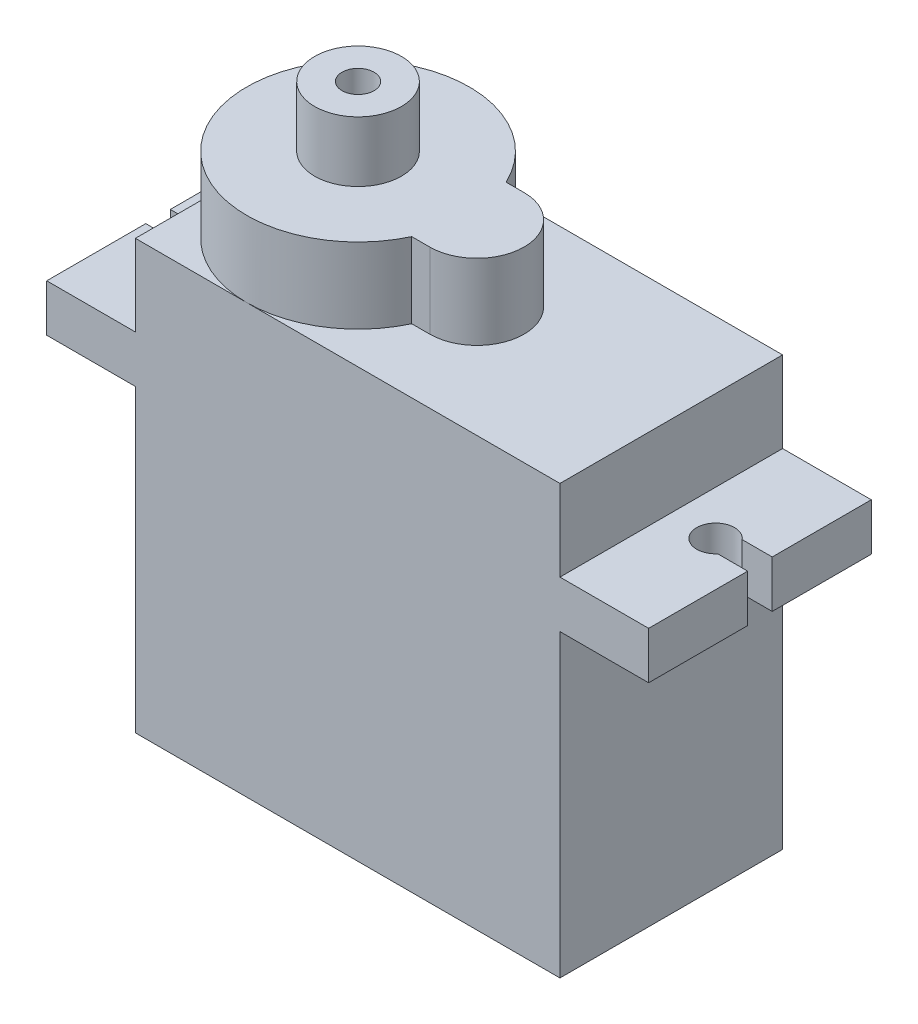
ISO-10303-21;
HEADER;
FILE_DESCRIPTION(('STEP AP214'),'2;1');
FILE_NAME('part.step','',(''),(''),'','','');
FILE_SCHEMA(('AUTOMOTIVE_DESIGN { 1 0 10303 214 1 1 1 1 }'));
ENDSEC;
DATA;
#1=APPLICATION_CONTEXT('core data for automotive mechanical design processes');
#2=APPLICATION_PROTOCOL_DEFINITION('international standard','automotive_design',2000,#1);
#3=PRODUCT_CONTEXT('',#1,'mechanical');
#4=PRODUCT('Part','Part','',(#3));
#5=PRODUCT_RELATED_PRODUCT_CATEGORY('part','',(#4));
#6=PRODUCT_DEFINITION_FORMATION('','',#4);
#7=PRODUCT_DEFINITION_CONTEXT('part definition',#1,'design');
#8=PRODUCT_DEFINITION('design','',#6,#7);
#9=PRODUCT_DEFINITION_SHAPE('','',#8);
#10=(LENGTH_UNIT() NAMED_UNIT(*) SI_UNIT(.MILLI.,.METRE.));
#11=(NAMED_UNIT(*) PLANE_ANGLE_UNIT() SI_UNIT($,.RADIAN.));
#12=(NAMED_UNIT(*) SI_UNIT($,.STERADIAN.) SOLID_ANGLE_UNIT());
#13=UNCERTAINTY_MEASURE_WITH_UNIT(LENGTH_MEASURE(1.E-05),#10,'distance_accuracy_value','');
#14=(GEOMETRIC_REPRESENTATION_CONTEXT(3) GLOBAL_UNCERTAINTY_ASSIGNED_CONTEXT((#13)) GLOBAL_UNIT_ASSIGNED_CONTEXT((#10,
#11,#12)) REPRESENTATION_CONTEXT('',''));
#15=CARTESIAN_POINT('',(0.,0.,0.));
#16=DIRECTION('',(0.,0.,1.));
#17=DIRECTION('',(1.,0.,0.));
#18=AXIS2_PLACEMENT_3D('',#15,#16,#17);
#19=CARTESIAN_POINT('',(-4.78141882639046,16.9586677185321,37.7999999999969));
#20=DIRECTION('',(0.,-1.,0.));
#21=DIRECTION('',(-0.804603244322576,0.,0.59381278129188));
#22=AXIS2_PLACEMENT_3D('',#19,#20,#21);
#23=CYLINDRICAL_SURFACE('',#22,2.3);
#24=CARTESIAN_POINT('',(-4.78141882639046,16.9586677185321,37.7999999999969));
#25=DIRECTION('',(0.,1.,0.));
#26=DIRECTION('',(0.804603244322576,0.,-0.59381278129188));
#27=AXIS2_PLACEMENT_3D('',#24,#25,#26);
#28=CIRCLE('',#27,2.3);
#29=CARTESIAN_POINT('',(-2.93083136444853,16.9586677185321,36.4342306030256));
#30=VERTEX_POINT('',#29);
#31=EDGE_CURVE('P0_E10',#30,#30,#28,.T.);
#32=ORIENTED_EDGE('',*,*,#31,.F.);
#33=EDGE_LOOP('',(#32));
#34=FACE_BOUND('',#33,.T.);
#35=CARTESIAN_POINT('',(-4.78141882639046,9.75866771853212,37.7999999999969));
#36=DIRECTION('',(0.,1.,0.));
#37=DIRECTION('',(0.804603244322576,0.,-0.59381278129188));
#38=AXIS2_PLACEMENT_3D('',#35,#36,#37);
#39=CIRCLE('',#38,2.3);
#40=CARTESIAN_POINT('',(-2.93083136444853,9.75866771853212,36.4342306030256));
#41=VERTEX_POINT('',#40);
#42=EDGE_CURVE('P0_E20',#41,#41,#39,.T.);
#43=ORIENTED_EDGE('',*,*,#42,.T.);
#44=EDGE_LOOP('',(#43));
#45=FACE_BOUND('',#44,.T.);
#46=ADVANCED_FACE('P0_F17',(#34,#45),#23,.T.);
#47=CARTESIAN_POINT('',(-4.78141882639046,16.9586677185321,37.7999999999969));
#48=DIRECTION('',(0.,1.,0.));
#49=DIRECTION('',(0.804603244322576,0.,-0.59381278129188));
#50=AXIS2_PLACEMENT_3D('',#47,#48,#49);
#51=PLANE('',#50);
#52=CARTESIAN_POINT('',(-4.78141882639046,16.9586677185321,37.7999999999969));
#53=DIRECTION('',(0.,1.,0.));
#54=DIRECTION('',(0.804603244322576,0.,-0.59381278129188));
#55=AXIS2_PLACEMENT_3D('',#52,#53,#54);
#56=CIRCLE('',#55,0.85);
#57=CARTESIAN_POINT('',(-4.09750606871627,16.9586677185321,37.2952591358988));
#58=VERTEX_POINT('',#57);
#59=EDGE_CURVE('P0_E29',#58,#58,#56,.T.);
#60=ORIENTED_EDGE('',*,*,#59,.F.);
#61=EDGE_LOOP('',(#60));
#62=FACE_BOUND('',#61,.T.);
#63=ORIENTED_EDGE('',*,*,#31,.T.);
#64=EDGE_LOOP('',(#63));
#65=FACE_BOUND('',#64,.T.);
#66=ADVANCED_FACE('P0_F44',(#62,#65),#51,.T.);
#67=CARTESIAN_POINT('',(-4.78141882639046,9.75866771853212,37.7999999999969));
#68=DIRECTION('',(0.,1.,0.));
#69=DIRECTION('',(0.804603244322576,0.,-0.59381278129188));
#70=AXIS2_PLACEMENT_3D('',#67,#68,#69);
#71=PLANE('',#70);
#72=ORIENTED_EDGE('',*,*,#42,.F.);
#73=EDGE_LOOP('',(#72));
#74=FACE_BOUND('',#73,.T.);
#75=ADVANCED_FACE('P0_F40',(#74),#71,.F.);
#76=CARTESIAN_POINT('',(-4.78141882639046,13.3586677185321,37.7999999999969));
#77=DIRECTION('',(0.,1.,0.));
#78=DIRECTION('',(0.804603244322576,0.,-0.59381278129188));
#79=AXIS2_PLACEMENT_3D('',#76,#77,#78);
#80=CYLINDRICAL_SURFACE('',#79,0.85);
#81=CARTESIAN_POINT('',(-4.78141882639046,13.3586677185321,37.7999999999969));
#82=DIRECTION('',(0.,1.,0.));
#83=DIRECTION('',(0.804603244322576,0.,-0.59381278129188));
#84=AXIS2_PLACEMENT_3D('',#81,#82,#83);
#85=CIRCLE('',#84,0.85);
#86=CARTESIAN_POINT('',(-4.09750606871627,13.3586677185321,37.2952591358988));
#87=VERTEX_POINT('',#86);
#88=EDGE_CURVE('P0_E27',#87,#87,#85,.T.);
#89=ORIENTED_EDGE('',*,*,#88,.F.);
#90=EDGE_LOOP('',(#89));
#91=FACE_BOUND('',#90,.T.);
#92=ORIENTED_EDGE('',*,*,#59,.T.);
#93=EDGE_LOOP('',(#92));
#94=FACE_BOUND('',#93,.T.);
#95=ADVANCED_FACE('P0_F37',(#91,#94),#80,.F.);
#96=CARTESIAN_POINT('',(-4.78141882639046,13.3586677185321,37.7999999999969));
#97=DIRECTION('',(0.,1.,0.));
#98=DIRECTION('',(0.804603244322576,0.,-0.59381278129188));
#99=AXIS2_PLACEMENT_3D('',#96,#97,#98);
#100=PLANE('',#99);
#101=ORIENTED_EDGE('',*,*,#88,.T.);
#102=EDGE_LOOP('',(#101));
#103=FACE_BOUND('',#102,.T.);
#104=ADVANCED_FACE('P0_F35',(#103),#100,.T.);
#105=CLOSED_SHELL('',(#46,#66,#75,#95,#104));
#106=MANIFOLD_SOLID_BREP('P0_B1',#105);
#107=CARTESIAN_POINT('',(11.8185811736095,2.95866771853212,43.6999999999969));
#108=DIRECTION('',(0.,1.,0.));
#109=DIRECTION('',(-1.,0.,0.));
#110=AXIS2_PLACEMENT_3D('',#107,#108,#109);
#111=PLANE('',#110);
#112=DIRECTION('',(1.,0.,0.));
#113=VECTOR('',#112,1.);
#114=CARTESIAN_POINT('',(11.8185811736095,2.95866771853212,37.1499999999969));
#115=LINE('',#114,#113);
#116=CARTESIAN_POINT('',(14.9285153812881,2.95866771853213,37.1499999999969));
#117=VERTEX_POINT('',#116);
#118=CARTESIAN_POINT('',(16.5185811736095,2.95866771853213,37.1499999999969));
#119=VERTEX_POINT('',#118);
#120=EDGE_CURVE('P1_E430',#117,#119,#115,.T.);
#121=ORIENTED_EDGE('',*,*,#120,.F.);
#122=CARTESIAN_POINT('',(14.1685811736095,2.95866771853212,37.7999999999969));
#123=DIRECTION('',(0.,1.,0.));
#124=DIRECTION('',(-1.,0.,0.));
#125=AXIS2_PLACEMENT_3D('',#122,#123,#124);
#126=CIRCLE('',#125,1.);
#127=CARTESIAN_POINT('',(14.9285153812881,2.95866771853213,38.4499999999969));
#128=VERTEX_POINT('',#127);
#129=EDGE_CURVE('P1_E429',#128,#117,#126,.F.);
#130=ORIENTED_EDGE('',*,*,#129,.F.);
#131=DIRECTION('',(-1.,0.,0.));
#132=VECTOR('',#131,1.);
#133=CARTESIAN_POINT('',(11.8185811736095,2.95866771853212,38.4499999999969));
#134=LINE('',#133,#132);
#135=CARTESIAN_POINT('',(16.5185811736095,2.95866771853213,38.4499999999969));
#136=VERTEX_POINT('',#135);
#137=EDGE_CURVE('P1_E428',#136,#128,#134,.T.);
#138=ORIENTED_EDGE('',*,*,#137,.F.);
#139=DIRECTION('',(0.,0.,-1.));
#140=VECTOR('',#139,1.);
#141=CARTESIAN_POINT('',(16.5185811736095,2.95866771853213,43.6999999999969));
#142=LINE('',#141,#140);
#143=CARTESIAN_POINT('',(16.5185811736095,2.95866771853213,43.6999999999969));
#144=VERTEX_POINT('',#143);
#145=EDGE_CURVE('P1_E207',#144,#136,#142,.T.);
#146=ORIENTED_EDGE('',*,*,#145,.F.);
#147=DIRECTION('',(1.,0.,0.));
#148=VECTOR('',#147,1.);
#149=CARTESIAN_POINT('',(11.8185811736095,2.95866771853212,43.6999999999969));
#150=LINE('',#149,#148);
#151=CARTESIAN_POINT('',(11.8185811736095,2.95866771853212,43.6999999999969));
#152=VERTEX_POINT('',#151);
#153=EDGE_CURVE('P1_E309',#152,#144,#150,.T.);
#154=ORIENTED_EDGE('',*,*,#153,.F.);
#155=DIRECTION('',(0.,0.,-1.));
#156=VECTOR('',#155,1.);
#157=CARTESIAN_POINT('',(11.8185811736095,2.95866771853212,43.6999999999969));
#158=LINE('',#157,#156);
#159=CARTESIAN_POINT('',(11.8185811736095,2.95866771853212,31.8999999999969));
#160=VERTEX_POINT('',#159);
#161=EDGE_CURVE('P1_E222',#152,#160,#158,.T.);
#162=ORIENTED_EDGE('',*,*,#161,.T.);
#163=DIRECTION('',(1.,0.,0.));
#164=VECTOR('',#163,1.);
#165=CARTESIAN_POINT('',(11.8185811736095,2.95866771853212,31.8999999999969));
#166=LINE('',#165,#164);
#167=CARTESIAN_POINT('',(16.5185811736095,2.95866771853213,31.8999999999969));
#168=VERTEX_POINT('',#167);
#169=EDGE_CURVE('P1_E335',#160,#168,#166,.T.);
#170=ORIENTED_EDGE('',*,*,#169,.T.);
#171=EDGE_CURVE('P1_E214',#119,#168,#142,.T.);
#172=ORIENTED_EDGE('',*,*,#171,.F.);
#173=EDGE_LOOP('',(#121,#130,#138,#146,#154,#162,#170,#172));
#174=FACE_BOUND('',#173,.T.);
#175=ADVANCED_FACE('P1_F19',(#174),#111,.F.);
#176=CARTESIAN_POINT('',(16.5185811736095,2.95866771853213,43.6999999999969));
#177=DIRECTION('',(-1.,0.,0.));
#178=DIRECTION('',(0.,-1.,0.));
#179=AXIS2_PLACEMENT_3D('',#176,#177,#178);
#180=PLANE('',#179);
#181=DIRECTION('',(0.,1.,0.));
#182=VECTOR('',#181,1.);
#183=CARTESIAN_POINT('',(16.5185811736095,1.45866771853212,37.1499999999969));
#184=LINE('',#183,#182);
#185=CARTESIAN_POINT('',(16.5185811736095,5.45866771853212,37.1499999999969));
#186=VERTEX_POINT('',#185);
#187=EDGE_CURVE('P1_E208',#119,#186,#184,.T.);
#188=ORIENTED_EDGE('',*,*,#187,.F.);
#189=ORIENTED_EDGE('',*,*,#171,.T.);
#190=DIRECTION('',(0.,1.,0.));
#191=VECTOR('',#190,1.);
#192=CARTESIAN_POINT('',(16.5185811736095,2.95866771853213,31.8999999999969));
#193=LINE('',#192,#191);
#194=CARTESIAN_POINT('',(16.5185811736095,5.45866771853212,31.8999999999969));
#195=VERTEX_POINT('',#194);
#196=EDGE_CURVE('P1_E338',#168,#195,#193,.T.);
#197=ORIENTED_EDGE('',*,*,#196,.T.);
#198=DIRECTION('',(0.,0.,-1.));
#199=VECTOR('',#198,1.);
#200=CARTESIAN_POINT('',(16.5185811736095,5.45866771853212,43.6999999999969));
#201=LINE('',#200,#199);
#202=EDGE_CURVE('P1_E215',#186,#195,#201,.T.);
#203=ORIENTED_EDGE('',*,*,#202,.F.);
#204=EDGE_LOOP('',(#188,#189,#197,#203));
#205=FACE_BOUND('',#204,.T.);
#206=ADVANCED_FACE('P1_F479',(#205),#180,.F.);
#207=DIRECTION('',(0.,1.,0.));
#208=VECTOR('',#207,1.);
#209=CARTESIAN_POINT('',(16.5185811736095,1.45866771853212,38.4499999999969));
#210=LINE('',#209,#208);
#211=CARTESIAN_POINT('',(16.5185811736095,5.45866771853212,38.4499999999969));
#212=VERTEX_POINT('',#211);
#213=EDGE_CURVE('P1_E192',#136,#212,#210,.T.);
#214=ORIENTED_EDGE('',*,*,#213,.T.);
#215=CARTESIAN_POINT('',(16.5185811736095,5.45866771853212,43.6999999999969));
#216=VERTEX_POINT('',#215);
#217=EDGE_CURVE('P1_E204',#216,#212,#201,.T.);
#218=ORIENTED_EDGE('',*,*,#217,.F.);
#219=DIRECTION('',(0.,1.,0.));
#220=VECTOR('',#219,1.);
#221=CARTESIAN_POINT('',(16.5185811736095,2.95866771853213,43.6999999999969));
#222=LINE('',#221,#220);
#223=EDGE_CURVE('P1_E311',#144,#216,#222,.T.);
#224=ORIENTED_EDGE('',*,*,#223,.F.);
#225=ORIENTED_EDGE('',*,*,#145,.T.);
#226=EDGE_LOOP('',(#214,#218,#224,#225));
#227=FACE_BOUND('',#226,.T.);
#228=ADVANCED_FACE('P1_F202',(#227),#180,.F.);
#229=CARTESIAN_POINT('',(11.8185811736095,5.45866771853212,43.6999999999969));
#230=DIRECTION('',(0.,-1.,0.));
#231=DIRECTION('',(0.,0.,-1.));
#232=AXIS2_PLACEMENT_3D('',#229,#230,#231);
#233=PLANE('',#232);
#234=DIRECTION('',(1.,0.,0.));
#235=VECTOR('',#234,1.);
#236=CARTESIAN_POINT('',(16.5185811736095,5.45866771853212,37.1499999999969));
#237=LINE('',#236,#235);
#238=CARTESIAN_POINT('',(14.9285153812881,5.45866771853212,37.1499999999969));
#239=VERTEX_POINT('',#238);
#240=EDGE_CURVE('P1_E197',#239,#186,#237,.T.);
#241=ORIENTED_EDGE('',*,*,#240,.T.);
#242=ORIENTED_EDGE('',*,*,#202,.T.);
#243=DIRECTION('',(-1.,0.,0.));
#244=VECTOR('',#243,1.);
#245=CARTESIAN_POINT('',(11.8185811736095,5.45866771853212,31.8999999999969));
#246=LINE('',#245,#244);
#247=CARTESIAN_POINT('',(11.8185811736095,5.45866771853212,31.8999999999969));
#248=VERTEX_POINT('',#247);
#249=EDGE_CURVE('P1_E341',#195,#248,#246,.T.);
#250=ORIENTED_EDGE('',*,*,#249,.T.);
#251=DIRECTION('',(0.,0.,-1.));
#252=VECTOR('',#251,1.);
#253=CARTESIAN_POINT('',(11.8185811736095,5.45866771853212,43.6999999999969));
#254=LINE('',#253,#252);
#255=CARTESIAN_POINT('',(11.8185811736095,5.45866771853212,43.6999999999969));
#256=VERTEX_POINT('',#255);
#257=EDGE_CURVE('P1_E218',#256,#248,#254,.T.);
#258=ORIENTED_EDGE('',*,*,#257,.F.);
#259=DIRECTION('',(-1.,0.,0.));
#260=VECTOR('',#259,1.);
#261=CARTESIAN_POINT('',(11.8185811736095,5.45866771853212,43.6999999999969));
#262=LINE('',#261,#260);
#263=EDGE_CURVE('P1_E213',#216,#256,#262,.T.);
#264=ORIENTED_EDGE('',*,*,#263,.F.);
#265=ORIENTED_EDGE('',*,*,#217,.T.);
#266=DIRECTION('',(-1.,0.,0.));
#267=VECTOR('',#266,1.);
#268=CARTESIAN_POINT('',(16.5185811736095,5.45866771853212,38.4499999999969));
#269=LINE('',#268,#267);
#270=CARTESIAN_POINT('',(14.9285153812881,5.45866771853212,38.4499999999969));
#271=VERTEX_POINT('',#270);
#272=EDGE_CURVE('P1_E189',#212,#271,#269,.T.);
#273=ORIENTED_EDGE('',*,*,#272,.T.);
#274=CARTESIAN_POINT('',(14.1685811736095,5.45866771853212,37.7999999999969));
#275=DIRECTION('',(0.,-1.,0.));
#276=DIRECTION('',(0.,0.,1.));
#277=AXIS2_PLACEMENT_3D('',#274,#275,#276);
#278=CIRCLE('',#277,1.);
#279=EDGE_CURVE('P1_E34',#271,#239,#278,.T.);
#280=ORIENTED_EDGE('',*,*,#279,.T.);
#281=EDGE_LOOP('',(#241,#242,#250,#258,#264,#265,#273,#280));
#282=FACE_BOUND('',#281,.T.);
#283=ADVANCED_FACE('P1_F211',(#282),#233,.F.);
#284=CARTESIAN_POINT('',(-15.3814188263905,2.95866771853212,43.6999999999969));
#285=DIRECTION('',(1.,0.,0.));
#286=DIRECTION('',(0.,0.,-1.));
#287=AXIS2_PLACEMENT_3D('',#284,#285,#286);
#288=PLANE('',#287);
#289=DIRECTION('',(0.,0.,-1.));
#290=VECTOR('',#289,1.);
#291=CARTESIAN_POINT('',(-15.3814188263905,5.45866771853212,43.6999999999969));
#292=LINE('',#291,#290);
#293=CARTESIAN_POINT('',(-15.3814188263905,5.45866771853212,43.6999999999969));
#294=VERTEX_POINT('',#293);
#295=CARTESIAN_POINT('',(-15.3814188263905,5.45866771853212,38.4499999999969));
#296=VERTEX_POINT('',#295);
#297=EDGE_CURVE('P1_E364',#294,#296,#292,.T.);
#298=ORIENTED_EDGE('',*,*,#297,.T.);
#299=DIRECTION('',(0.,1.,0.));
#300=VECTOR('',#299,1.);
#301=CARTESIAN_POINT('',(-15.3814188263905,1.45866771853212,38.4499999999969));
#302=LINE('',#301,#300);
#303=CARTESIAN_POINT('',(-15.3814188263905,2.95866771853212,38.4499999999969));
#304=VERTEX_POINT('',#303);
#305=EDGE_CURVE('P1_E254',#304,#296,#302,.T.);
#306=ORIENTED_EDGE('',*,*,#305,.F.);
#307=DIRECTION('',(0.,0.,-1.));
#308=VECTOR('',#307,1.);
#309=CARTESIAN_POINT('',(-15.3814188263905,2.95866771853212,43.6999999999969));
#310=LINE('',#309,#308);
#311=CARTESIAN_POINT('',(-15.3814188263905,2.95866771853212,43.6999999999969));
#312=VERTEX_POINT('',#311);
#313=EDGE_CURVE('P1_E361',#312,#304,#310,.T.);
#314=ORIENTED_EDGE('',*,*,#313,.F.);
#315=DIRECTION('',(0.,-1.,0.));
#316=VECTOR('',#315,1.);
#317=CARTESIAN_POINT('',(-15.3814188263905,2.95866771853212,43.6999999999969));
#318=LINE('',#317,#316);
#319=EDGE_CURVE('P1_E324',#294,#312,#318,.T.);
#320=ORIENTED_EDGE('',*,*,#319,.F.);
#321=EDGE_LOOP('',(#298,#306,#314,#320));
#322=FACE_BOUND('',#321,.T.);
#323=ADVANCED_FACE('P1_F461',(#322),#288,.F.);
#324=CARTESIAN_POINT('',(-10.6814188263905,9.75866771853212,43.6999999999969));
#325=DIRECTION('',(0.,-1.,0.));
#326=DIRECTION('',(0.,0.,-1.));
#327=AXIS2_PLACEMENT_3D('',#324,#325,#326);
#328=PLANE('',#327);
#329=CARTESIAN_POINT('',(-4.78141882639046,9.75866771853212,37.7999999999969));
#330=DIRECTION('',(0.,1.,0.));
#331=DIRECTION('',(0.,0.,1.));
#332=AXIS2_PLACEMENT_3D('',#329,#330,#331);
#333=CIRCLE('',#332,5.9);
#334=CARTESIAN_POINT('',(-10.6814188263905,9.75866771853212,37.7999999999969));
#335=VERTEX_POINT('',#334);
#336=CARTESIAN_POINT('',(-4.78141882639046,9.75866771853212,43.6999999999969));
#337=VERTEX_POINT('',#336);
#338=EDGE_CURVE('P1_E233',#335,#337,#333,.T.);
#339=ORIENTED_EDGE('',*,*,#338,.F.);
#340=DIRECTION('',(0.,0.,-1.));
#341=VECTOR('',#340,1.);
#342=CARTESIAN_POINT('',(-10.6814188263905,9.75866771853212,43.6999999999969));
#343=LINE('',#342,#341);
#344=CARTESIAN_POINT('',(-10.6814188263905,9.75866771853212,43.6999999999969));
#345=VERTEX_POINT('',#344);
#346=EDGE_CURVE('P1_E371',#345,#335,#343,.T.);
#347=ORIENTED_EDGE('',*,*,#346,.F.);
#348=DIRECTION('',(-1.,0.,0.));
#349=VECTOR('',#348,1.);
#350=CARTESIAN_POINT('',(-10.6814188263905,9.75866771853212,43.6999999999969));
#351=LINE('',#350,#349);
#352=EDGE_CURVE('P1_E316',#337,#345,#351,.T.);
#353=ORIENTED_EDGE('',*,*,#352,.F.);
#354=EDGE_LOOP('',(#339,#347,#353));
#355=FACE_BOUND('',#354,.T.);
#356=ADVANCED_FACE('P1_F417',(#355),#328,.F.);
#357=CARTESIAN_POINT('',(0.5627368599645,9.75866771853212,40.2999999999969));
#358=VERTEX_POINT('',#357);
#359=EDGE_CURVE('P1_E413',#337,#358,#333,.T.);
#360=ORIENTED_EDGE('',*,*,#359,.F.);
#361=CARTESIAN_POINT('',(11.8185811736095,9.75866771853212,43.6999999999969));
#362=VERTEX_POINT('',#361);
#363=EDGE_CURVE('P1_E317',#362,#337,#351,.T.);
#364=ORIENTED_EDGE('',*,*,#363,.F.);
#365=DIRECTION('',(0.,0.,-1.));
#366=VECTOR('',#365,1.);
#367=CARTESIAN_POINT('',(11.8185811736095,9.75866771853212,43.6999999999969));
#368=LINE('',#367,#366);
#369=CARTESIAN_POINT('',(11.8185811736095,9.75866771853212,31.8999999999969));
#370=VERTEX_POINT('',#369);
#371=EDGE_CURVE('P1_E373',#362,#370,#368,.T.);
#372=ORIENTED_EDGE('',*,*,#371,.T.);
#373=DIRECTION('',(-1.,0.,0.));
#374=VECTOR('',#373,1.);
#375=CARTESIAN_POINT('',(-10.6814188263905,9.75866771853212,31.8999999999969));
#376=LINE('',#375,#374);
#377=CARTESIAN_POINT('',(-4.78141882639046,9.75866771853212,31.8999999999969));
#378=VERTEX_POINT('',#377);
#379=EDGE_CURVE('P1_E346',#370,#378,#376,.T.);
#380=ORIENTED_EDGE('',*,*,#379,.T.);
#381=CARTESIAN_POINT('',(0.5627368599645,9.75866771853212,35.2999999999969));
#382=VERTEX_POINT('',#381);
#383=EDGE_CURVE('P1_E284',#382,#378,#333,.T.);
#384=ORIENTED_EDGE('',*,*,#383,.F.);
#385=DIRECTION('',(-1.,0.,0.));
#386=VECTOR('',#385,1.);
#387=CARTESIAN_POINT('',(1.51858117360954,9.75866771853212,35.2999999999969));
#388=LINE('',#387,#386);
#389=CARTESIAN_POINT('',(1.51858117360954,9.75866771853212,35.2999999999969));
#390=VERTEX_POINT('',#389);
#391=EDGE_CURVE('P1_E281',#390,#382,#388,.T.);
#392=ORIENTED_EDGE('',*,*,#391,.F.);
#393=CARTESIAN_POINT('',(1.51858117360954,9.75866771853212,37.7999999999969));
#394=DIRECTION('',(0.,1.,0.));
#395=DIRECTION('',(0.,0.,1.));
#396=AXIS2_PLACEMENT_3D('',#393,#394,#395);
#397=CIRCLE('',#396,2.5);
#398=CARTESIAN_POINT('',(1.51858117360954,9.75866771853212,40.2999999999969));
#399=VERTEX_POINT('',#398);
#400=EDGE_CURVE('P1_E266',#399,#390,#397,.T.);
#401=ORIENTED_EDGE('',*,*,#400,.F.);
#402=DIRECTION('',(1.,0.,0.));
#403=VECTOR('',#402,1.);
#404=CARTESIAN_POINT('',(1.51858117360954,9.75866771853212,40.2999999999969));
#405=LINE('',#404,#403);
#406=EDGE_CURVE('P1_E272',#358,#399,#405,.T.);
#407=ORIENTED_EDGE('',*,*,#406,.F.);
#408=EDGE_LOOP('',(#360,#364,#372,#380,#384,#392,#401,#407));
#409=FACE_BOUND('',#408,.T.);
#410=ADVANCED_FACE('P1_F392',(#409),#328,.F.);
#411=EDGE_CURVE('P1_E231',#378,#335,#333,.T.);
#412=ORIENTED_EDGE('',*,*,#411,.F.);
#413=CARTESIAN_POINT('',(-10.6814188263905,9.75866771853212,31.8999999999969));
#414=VERTEX_POINT('',#413);
#415=EDGE_CURVE('P1_E345',#378,#414,#376,.T.);
#416=ORIENTED_EDGE('',*,*,#415,.T.);
#417=EDGE_CURVE('P1_E370',#335,#414,#343,.T.);
#418=ORIENTED_EDGE('',*,*,#417,.F.);
#419=EDGE_LOOP('',(#412,#416,#418));
#420=FACE_BOUND('',#419,.T.);
#421=ADVANCED_FACE('P1_F466',(#420),#328,.F.);
#422=CARTESIAN_POINT('',(-10.6814188263905,-12.9413322814679,43.6999999999969));
#423=DIRECTION('',(1.,0.,0.));
#424=DIRECTION('',(0.,0.,-1.));
#425=AXIS2_PLACEMENT_3D('',#422,#423,#424);
#426=PLANE('',#425);
#427=DIRECTION('',(0.,-1.,0.));
#428=VECTOR('',#427,1.);
#429=CARTESIAN_POINT('',(-10.6814188263905,-12.9413322814679,31.8999999999969));
#430=LINE('',#429,#428);
#431=CARTESIAN_POINT('',(-10.6814188263905,2.95866771853212,31.8999999999969));
#432=VERTEX_POINT('',#431);
#433=CARTESIAN_POINT('',(-10.6814188263905,-12.9413322814679,31.8999999999969));
#434=VERTEX_POINT('',#433);
#435=EDGE_CURVE('P1_E300',#432,#434,#430,.T.);
#436=ORIENTED_EDGE('',*,*,#435,.T.);
#437=DIRECTION('',(0.,0.,-1.));
#438=VECTOR('',#437,1.);
#439=CARTESIAN_POINT('',(-10.6814188263905,-12.9413322814679,43.6999999999969));
#440=LINE('',#439,#438);
#441=CARTESIAN_POINT('',(-10.6814188263905,-12.9413322814679,43.6999999999969));
#442=VERTEX_POINT('',#441);
#443=EDGE_CURVE('P1_E228',#442,#434,#440,.T.);
#444=ORIENTED_EDGE('',*,*,#443,.F.);
#445=DIRECTION('',(0.,-1.,0.));
#446=VECTOR('',#445,1.);
#447=CARTESIAN_POINT('',(-10.6814188263905,-12.9413322814679,43.6999999999969));
#448=LINE('',#447,#446);
#449=CARTESIAN_POINT('',(-10.6814188263905,2.95866771853212,43.6999999999969));
#450=VERTEX_POINT('',#449);
#451=EDGE_CURVE('P1_E301',#450,#442,#448,.T.);
#452=ORIENTED_EDGE('',*,*,#451,.F.);
#453=DIRECTION('',(0.,0.,-1.));
#454=VECTOR('',#453,1.);
#455=CARTESIAN_POINT('',(-10.6814188263905,2.95866771853212,43.6999999999969));
#456=LINE('',#455,#454);
#457=EDGE_CURVE('P1_E328',#450,#432,#456,.T.);
#458=ORIENTED_EDGE('',*,*,#457,.T.);
#459=EDGE_LOOP('',(#436,#444,#452,#458));
#460=FACE_BOUND('',#459,.T.);
#461=ADVANCED_FACE('P1_F21',(#460),#426,.F.);
#462=CARTESIAN_POINT('',(-10.6814188263905,-12.9413322814679,43.6999999999969));
#463=DIRECTION('',(0.,1.,0.));
#464=DIRECTION('',(0.,0.,1.));
#465=AXIS2_PLACEMENT_3D('',#462,#463,#464);
#466=PLANE('',#465);
#467=DIRECTION('',(1.,0.,0.));
#468=VECTOR('',#467,1.);
#469=CARTESIAN_POINT('',(-10.6814188263905,-12.9413322814679,31.8999999999969));
#470=LINE('',#469,#468);
#471=CARTESIAN_POINT('',(11.8185811736095,-12.9413322814679,31.8999999999969));
#472=VERTEX_POINT('',#471);
#473=EDGE_CURVE('P1_E331',#434,#472,#470,.T.);
#474=ORIENTED_EDGE('',*,*,#473,.T.);
#475=DIRECTION('',(0.,0.,-1.));
#476=VECTOR('',#475,1.);
#477=CARTESIAN_POINT('',(11.8185811736095,-12.9413322814679,43.6999999999969));
#478=LINE('',#477,#476);
#479=CARTESIAN_POINT('',(11.8185811736095,-12.9413322814679,43.6999999999969));
#480=VERTEX_POINT('',#479);
#481=EDGE_CURVE('P1_E225',#480,#472,#478,.T.);
#482=ORIENTED_EDGE('',*,*,#481,.F.);
#483=DIRECTION('',(1.,0.,0.));
#484=VECTOR('',#483,1.);
#485=CARTESIAN_POINT('',(-10.6814188263905,-12.9413322814679,43.6999999999969));
#486=LINE('',#485,#484);
#487=EDGE_CURVE('P1_E304',#442,#480,#486,.T.);
#488=ORIENTED_EDGE('',*,*,#487,.F.);
#489=ORIENTED_EDGE('',*,*,#443,.T.);
#490=EDGE_LOOP('',(#474,#482,#488,#489));
#491=FACE_BOUND('',#490,.T.);
#492=ADVANCED_FACE('P1_F474',(#491),#466,.F.);
#493=CARTESIAN_POINT('',(11.8185811736095,-12.9413322814679,43.6999999999969));
#494=DIRECTION('',(-1.,0.,0.));
#495=DIRECTION('',(0.,0.,1.));
#496=AXIS2_PLACEMENT_3D('',#493,#494,#495);
#497=PLANE('',#496);
#498=DIRECTION('',(0.,1.,0.));
#499=VECTOR('',#498,1.);
#500=CARTESIAN_POINT('',(11.8185811736095,-12.9413322814679,31.8999999999969));
#501=LINE('',#500,#499);
#502=EDGE_CURVE('P1_E333',#472,#160,#501,.T.);
#503=ORIENTED_EDGE('',*,*,#502,.T.);
#504=ORIENTED_EDGE('',*,*,#161,.F.);
#505=DIRECTION('',(0.,1.,0.));
#506=VECTOR('',#505,1.);
#507=CARTESIAN_POINT('',(11.8185811736095,-12.9413322814679,43.6999999999969));
#508=LINE('',#507,#506);
#509=EDGE_CURVE('P1_E307',#480,#152,#508,.T.);
#510=ORIENTED_EDGE('',*,*,#509,.F.);
#511=ORIENTED_EDGE('',*,*,#481,.T.);
#512=EDGE_LOOP('',(#503,#504,#510,#511));
#513=FACE_BOUND('',#512,.T.);
#514=ADVANCED_FACE('P1_F488',(#513),#497,.F.);
#515=CARTESIAN_POINT('',(11.8185811736095,5.45866771853212,43.6999999999969));
#516=DIRECTION('',(-1.,0.,0.));
#517=DIRECTION('',(0.,0.,1.));
#518=AXIS2_PLACEMENT_3D('',#515,#516,#517);
#519=PLANE('',#518);
#520=DIRECTION('',(0.,1.,0.));
#521=VECTOR('',#520,1.);
#522=CARTESIAN_POINT('',(11.8185811736095,5.45866771853212,31.8999999999969));
#523=LINE('',#522,#521);
#524=EDGE_CURVE('P1_E343',#248,#370,#523,.T.);
#525=ORIENTED_EDGE('',*,*,#524,.T.);
#526=ORIENTED_EDGE('',*,*,#371,.F.);
#527=DIRECTION('',(0.,1.,0.));
#528=VECTOR('',#527,1.);
#529=CARTESIAN_POINT('',(11.8185811736095,5.45866771853212,43.6999999999969));
#530=LINE('',#529,#528);
#531=EDGE_CURVE('P1_E314',#256,#362,#530,.T.);
#532=ORIENTED_EDGE('',*,*,#531,.F.);
#533=ORIENTED_EDGE('',*,*,#257,.T.);
#534=EDGE_LOOP('',(#525,#526,#532,#533));
#535=FACE_BOUND('',#534,.T.);
#536=ADVANCED_FACE('P1_F383',(#535),#519,.F.);
#537=CARTESIAN_POINT('',(-10.6814188263905,5.45866771853212,43.6999999999969));
#538=DIRECTION('',(1.,0.,0.));
#539=DIRECTION('',(0.,0.,-1.));
#540=AXIS2_PLACEMENT_3D('',#537,#538,#539);
#541=PLANE('',#540);
#542=DIRECTION('',(0.,-1.,0.));
#543=VECTOR('',#542,1.);
#544=CARTESIAN_POINT('',(-10.6814188263905,5.45866771853212,31.8999999999969));
#545=LINE('',#544,#543);
#546=CARTESIAN_POINT('',(-10.6814188263905,5.45866771853212,31.8999999999969));
#547=VERTEX_POINT('',#546);
#548=EDGE_CURVE('P1_E349',#414,#547,#545,.T.);
#549=ORIENTED_EDGE('',*,*,#548,.T.);
#550=DIRECTION('',(0.,0.,-1.));
#551=VECTOR('',#550,1.);
#552=CARTESIAN_POINT('',(-10.6814188263905,5.45866771853212,43.6999999999969));
#553=LINE('',#552,#551);
#554=CARTESIAN_POINT('',(-10.6814188263905,5.45866771853212,43.6999999999969));
#555=VERTEX_POINT('',#554);
#556=EDGE_CURVE('P1_E367',#555,#547,#553,.T.);
#557=ORIENTED_EDGE('',*,*,#556,.F.);
#558=DIRECTION('',(0.,-1.,0.));
#559=VECTOR('',#558,1.);
#560=CARTESIAN_POINT('',(-10.6814188263905,5.45866771853212,43.6999999999969));
#561=LINE('',#560,#559);
#562=EDGE_CURVE('P1_E320',#345,#555,#561,.T.);
#563=ORIENTED_EDGE('',*,*,#562,.F.);
#564=ORIENTED_EDGE('',*,*,#346,.T.);
#565=ORIENTED_EDGE('',*,*,#417,.T.);
#566=EDGE_LOOP('',(#549,#557,#563,#564,#565));
#567=FACE_BOUND('',#566,.T.);
#568=ADVANCED_FACE('P1_F464',(#567),#541,.F.);
#569=CARTESIAN_POINT('',(-15.3814188263905,5.45866771853212,43.6999999999969));
#570=DIRECTION('',(0.,-1.,0.));
#571=DIRECTION('',(0.,0.,-1.));
#572=AXIS2_PLACEMENT_3D('',#569,#570,#571);
#573=PLANE('',#572);
#574=CARTESIAN_POINT('',(-13.0314188263905,5.45866771853212,37.7999999999969));
#575=DIRECTION('',(0.,1.,0.));
#576=DIRECTION('',(0.,0.,1.));
#577=AXIS2_PLACEMENT_3D('',#574,#575,#576);
#578=CIRCLE('',#577,1.);
#579=CARTESIAN_POINT('',(-13.791353034069,5.45866771853212,38.4499999999969));
#580=VERTEX_POINT('',#579);
#581=CARTESIAN_POINT('',(-13.791353034069,5.45866771853212,37.1499999999969));
#582=VERTEX_POINT('',#581);
#583=EDGE_CURVE('P1_E438',#580,#582,#578,.T.);
#584=ORIENTED_EDGE('',*,*,#583,.F.);
#585=DIRECTION('',(1.,0.,0.));
#586=VECTOR('',#585,1.);
#587=CARTESIAN_POINT('',(-15.3814188263905,5.45866771853212,38.4499999999969));
#588=LINE('',#587,#586);
#589=EDGE_CURVE('P1_E251',#296,#580,#588,.T.);
#590=ORIENTED_EDGE('',*,*,#589,.F.);
#591=ORIENTED_EDGE('',*,*,#297,.F.);
#592=DIRECTION('',(-1.,0.,0.));
#593=VECTOR('',#592,1.);
#594=CARTESIAN_POINT('',(-15.3814188263905,5.45866771853212,43.6999999999969));
#595=LINE('',#594,#593);
#596=EDGE_CURVE('P1_E322',#555,#294,#595,.T.);
#597=ORIENTED_EDGE('',*,*,#596,.F.);
#598=ORIENTED_EDGE('',*,*,#556,.T.);
#599=DIRECTION('',(-1.,0.,0.));
#600=VECTOR('',#599,1.);
#601=CARTESIAN_POINT('',(-15.3814188263905,5.45866771853212,31.8999999999969));
#602=LINE('',#601,#600);
#603=CARTESIAN_POINT('',(-15.3814188263905,5.45866771853212,31.8999999999969));
#604=VERTEX_POINT('',#603);
#605=EDGE_CURVE('P1_E351',#547,#604,#602,.T.);
#606=ORIENTED_EDGE('',*,*,#605,.T.);
#607=CARTESIAN_POINT('',(-15.3814188263905,5.45866771853212,37.1499999999969));
#608=VERTEX_POINT('',#607);
#609=EDGE_CURVE('P1_E363',#608,#604,#292,.T.);
#610=ORIENTED_EDGE('',*,*,#609,.F.);
#611=DIRECTION('',(-1.,0.,0.));
#612=VECTOR('',#611,1.);
#613=CARTESIAN_POINT('',(-15.3814188263905,5.45866771853212,37.1499999999969));
#614=LINE('',#613,#612);
#615=EDGE_CURVE('P1_E439',#582,#608,#614,.T.);
#616=ORIENTED_EDGE('',*,*,#615,.F.);
#617=EDGE_LOOP('',(#584,#590,#591,#597,#598,#606,#610,#616));
#618=FACE_BOUND('',#617,.T.);
#619=ADVANCED_FACE('P1_F446',(#618),#573,.F.);
#620=CARTESIAN_POINT('',(-15.3814188263905,2.95866771853212,37.1499999999969));
#621=VERTEX_POINT('',#620);
#622=CARTESIAN_POINT('',(-15.3814188263905,2.95866771853212,31.8999999999969));
#623=VERTEX_POINT('',#622);
#624=EDGE_CURVE('P1_E360',#621,#623,#310,.T.);
#625=ORIENTED_EDGE('',*,*,#624,.F.);
#626=DIRECTION('',(0.,1.,0.));
#627=VECTOR('',#626,1.);
#628=CARTESIAN_POINT('',(-15.3814188263905,1.45866771853212,37.1499999999969));
#629=LINE('',#628,#627);
#630=EDGE_CURVE('P1_E42',#621,#608,#629,.T.);
#631=ORIENTED_EDGE('',*,*,#630,.T.);
#632=ORIENTED_EDGE('',*,*,#609,.T.);
#633=DIRECTION('',(0.,-1.,0.));
#634=VECTOR('',#633,1.);
#635=CARTESIAN_POINT('',(-15.3814188263905,2.95866771853212,31.8999999999969));
#636=LINE('',#635,#634);
#637=EDGE_CURVE('P1_E354',#604,#623,#636,.T.);
#638=ORIENTED_EDGE('',*,*,#637,.T.);
#639=EDGE_LOOP('',(#625,#631,#632,#638));
#640=FACE_BOUND('',#639,.T.);
#641=ADVANCED_FACE('P1_F445',(#640),#288,.F.);
#642=CARTESIAN_POINT('',(-15.3814188263905,2.95866771853212,43.6999999999969));
#643=DIRECTION('',(0.,1.,0.));
#644=DIRECTION('',(0.,0.,1.));
#645=AXIS2_PLACEMENT_3D('',#642,#643,#644);
#646=PLANE('',#645);
#647=ORIENTED_EDGE('',*,*,#313,.T.);
#648=DIRECTION('',(1.,0.,0.));
#649=VECTOR('',#648,1.);
#650=CARTESIAN_POINT('',(-15.3814188263905,2.95866771853212,38.4499999999969));
#651=LINE('',#650,#649);
#652=CARTESIAN_POINT('',(-13.791353034069,2.95866771853212,38.4499999999969));
#653=VERTEX_POINT('',#652);
#654=EDGE_CURVE('P1_E11',#304,#653,#651,.T.);
#655=ORIENTED_EDGE('',*,*,#654,.T.);
#656=CARTESIAN_POINT('',(-13.0314188263905,2.95866771853212,37.7999999999969));
#657=DIRECTION('',(0.,1.,0.));
#658=DIRECTION('',(0.,0.,1.));
#659=AXIS2_PLACEMENT_3D('',#656,#657,#658);
#660=CIRCLE('',#659,1.);
#661=CARTESIAN_POINT('',(-13.791353034069,2.95866771853212,37.1499999999969));
#662=VERTEX_POINT('',#661);
#663=EDGE_CURVE('P1_E27',#653,#662,#660,.T.);
#664=ORIENTED_EDGE('',*,*,#663,.T.);
#665=DIRECTION('',(-1.,0.,0.));
#666=VECTOR('',#665,1.);
#667=CARTESIAN_POINT('',(-15.3814188263905,2.95866771853212,37.1499999999969));
#668=LINE('',#667,#666);
#669=EDGE_CURVE('P1_E232',#662,#621,#668,.T.);
#670=ORIENTED_EDGE('',*,*,#669,.T.);
#671=ORIENTED_EDGE('',*,*,#624,.T.);
#672=DIRECTION('',(1.,0.,0.));
#673=VECTOR('',#672,1.);
#674=CARTESIAN_POINT('',(-15.3814188263905,2.95866771853212,31.8999999999969));
#675=LINE('',#674,#673);
#676=EDGE_CURVE('P1_E305',#623,#432,#675,.T.);
#677=ORIENTED_EDGE('',*,*,#676,.T.);
#678=ORIENTED_EDGE('',*,*,#457,.F.);
#679=DIRECTION('',(1.,0.,0.));
#680=VECTOR('',#679,1.);
#681=CARTESIAN_POINT('',(-15.3814188263905,2.95866771853212,43.6999999999969));
#682=LINE('',#681,#680);
#683=EDGE_CURVE('P1_E326',#312,#450,#682,.T.);
#684=ORIENTED_EDGE('',*,*,#683,.F.);
#685=EDGE_LOOP('',(#647,#655,#664,#670,#671,#677,#678,#684));
#686=FACE_BOUND('',#685,.T.);
#687=ADVANCED_FACE('P1_F237',(#686),#646,.F.);
#688=CARTESIAN_POINT('',(-10.6814188263905,-12.9413322814679,43.6999999999969));
#689=DIRECTION('',(0.,0.,-1.));
#690=DIRECTION('',(-1.,0.,0.));
#691=AXIS2_PLACEMENT_3D('',#688,#689,#690);
#692=PLANE('',#691);
#693=ORIENTED_EDGE('',*,*,#451,.T.);
#694=ORIENTED_EDGE('',*,*,#487,.T.);
#695=ORIENTED_EDGE('',*,*,#509,.T.);
#696=ORIENTED_EDGE('',*,*,#153,.T.);
#697=ORIENTED_EDGE('',*,*,#223,.T.);
#698=ORIENTED_EDGE('',*,*,#263,.T.);
#699=ORIENTED_EDGE('',*,*,#531,.T.);
#700=ORIENTED_EDGE('',*,*,#363,.T.);
#701=ORIENTED_EDGE('',*,*,#352,.T.);
#702=ORIENTED_EDGE('',*,*,#562,.T.);
#703=ORIENTED_EDGE('',*,*,#596,.T.);
#704=ORIENTED_EDGE('',*,*,#319,.T.);
#705=ORIENTED_EDGE('',*,*,#683,.T.);
#706=EDGE_LOOP('',(#693,#694,#695,#696,#697,#698,#699,#700,#701,#702,#703,#704,#705));
#707=FACE_BOUND('',#706,.T.);
#708=ADVANCED_FACE('P1_F421',(#707),#692,.F.);
#709=CARTESIAN_POINT('',(-10.6814188263905,-12.9413322814679,31.8999999999969));
#710=DIRECTION('',(0.,0.,-1.));
#711=DIRECTION('',(-1.,0.,0.));
#712=AXIS2_PLACEMENT_3D('',#709,#710,#711);
#713=PLANE('',#712);
#714=ORIENTED_EDGE('',*,*,#435,.F.);
#715=ORIENTED_EDGE('',*,*,#676,.F.);
#716=ORIENTED_EDGE('',*,*,#637,.F.);
#717=ORIENTED_EDGE('',*,*,#605,.F.);
#718=ORIENTED_EDGE('',*,*,#548,.F.);
#719=ORIENTED_EDGE('',*,*,#415,.F.);
#720=ORIENTED_EDGE('',*,*,#379,.F.);
#721=ORIENTED_EDGE('',*,*,#524,.F.);
#722=ORIENTED_EDGE('',*,*,#249,.F.);
#723=ORIENTED_EDGE('',*,*,#196,.F.);
#724=ORIENTED_EDGE('',*,*,#169,.F.);
#725=ORIENTED_EDGE('',*,*,#502,.F.);
#726=ORIENTED_EDGE('',*,*,#473,.F.);
#727=EDGE_LOOP('',(#714,#715,#716,#717,#718,#719,#720,#721,#722,#723,#724,#725,#726));
#728=FACE_BOUND('',#727,.T.);
#729=ADVANCED_FACE('P1_F387',(#728),#713,.T.);
#730=CARTESIAN_POINT('',(1.51858117360954,13.7586677185321,37.7999999999969));
#731=DIRECTION('',(0.,-1.,0.));
#732=DIRECTION('',(0.,0.,-1.));
#733=AXIS2_PLACEMENT_3D('',#730,#731,#732);
#734=CYLINDRICAL_SURFACE('',#733,2.5);
#735=ORIENTED_EDGE('',*,*,#400,.T.);
#736=DIRECTION('',(0.,-1.,0.));
#737=VECTOR('',#736,1.);
#738=CARTESIAN_POINT('',(1.51858117360954,13.7586677185321,35.2999999999969));
#739=LINE('',#738,#737);
#740=CARTESIAN_POINT('',(1.51858117360954,13.7586677185321,35.2999999999969));
#741=VERTEX_POINT('',#740);
#742=EDGE_CURVE('P1_E297',#741,#390,#739,.T.);
#743=ORIENTED_EDGE('',*,*,#742,.F.);
#744=CARTESIAN_POINT('',(1.51858117360954,13.7586677185321,37.7999999999969));
#745=DIRECTION('',(0.,1.,0.));
#746=DIRECTION('',(0.,0.,1.));
#747=AXIS2_PLACEMENT_3D('',#744,#745,#746);
#748=CIRCLE('',#747,2.5);
#749=CARTESIAN_POINT('',(1.51858117360954,13.7586677185321,40.2999999999969));
#750=VERTEX_POINT('',#749);
#751=EDGE_CURVE('P1_E268',#750,#741,#748,.T.);
#752=ORIENTED_EDGE('',*,*,#751,.F.);
#753=DIRECTION('',(0.,-1.,0.));
#754=VECTOR('',#753,1.);
#755=CARTESIAN_POINT('',(1.51858117360954,13.7586677185321,40.2999999999969));
#756=LINE('',#755,#754);
#757=EDGE_CURVE('P1_E278',#750,#399,#756,.T.);
#758=ORIENTED_EDGE('',*,*,#757,.T.);
#759=EDGE_LOOP('',(#735,#743,#752,#758));
#760=FACE_BOUND('',#759,.T.);
#761=ADVANCED_FACE('P1_F410',(#760),#734,.T.);
#762=CARTESIAN_POINT('',(1.51858117360954,13.7586677185321,35.2999999999969));
#763=DIRECTION('',(0.,0.,1.));
#764=DIRECTION('',(1.,0.,0.));
#765=AXIS2_PLACEMENT_3D('',#762,#763,#764);
#766=PLANE('',#765);
#767=ORIENTED_EDGE('',*,*,#391,.T.);
#768=DIRECTION('',(0.,-1.,0.));
#769=VECTOR('',#768,1.);
#770=CARTESIAN_POINT('',(0.5627368599645,13.7586677185321,35.2999999999969));
#771=LINE('',#770,#769);
#772=CARTESIAN_POINT('',(0.5627368599645,13.7586677185321,35.2999999999969));
#773=VERTEX_POINT('',#772);
#774=EDGE_CURVE('P1_E294',#773,#382,#771,.T.);
#775=ORIENTED_EDGE('',*,*,#774,.F.);
#776=DIRECTION('',(-1.,0.,0.));
#777=VECTOR('',#776,1.);
#778=CARTESIAN_POINT('',(1.51858117360954,13.7586677185321,35.2999999999969));
#779=LINE('',#778,#777);
#780=EDGE_CURVE('P1_E271',#741,#773,#779,.T.);
#781=ORIENTED_EDGE('',*,*,#780,.F.);
#782=ORIENTED_EDGE('',*,*,#742,.T.);
#783=EDGE_LOOP('',(#767,#775,#781,#782));
#784=FACE_BOUND('',#783,.T.);
#785=ADVANCED_FACE('P1_F401',(#784),#766,.F.);
#786=CARTESIAN_POINT('',(-4.78141882639046,13.7586677185321,37.7999999999969));
#787=DIRECTION('',(0.,-1.,0.));
#788=DIRECTION('',(0.,0.,-1.));
#789=AXIS2_PLACEMENT_3D('',#786,#787,#788);
#790=CYLINDRICAL_SURFACE('',#789,5.9);
#791=ORIENTED_EDGE('',*,*,#383,.T.);
#792=ORIENTED_EDGE('',*,*,#411,.T.);
#793=ORIENTED_EDGE('',*,*,#338,.T.);
#794=ORIENTED_EDGE('',*,*,#359,.T.);
#795=DIRECTION('',(0.,-1.,0.));
#796=VECTOR('',#795,1.);
#797=CARTESIAN_POINT('',(0.5627368599645,13.7586677185321,40.2999999999969));
#798=LINE('',#797,#796);
#799=CARTESIAN_POINT('',(0.5627368599645,13.7586677185321,40.2999999999969));
#800=VERTEX_POINT('',#799);
#801=EDGE_CURVE('P1_E291',#800,#358,#798,.T.);
#802=ORIENTED_EDGE('',*,*,#801,.F.);
#803=CARTESIAN_POINT('',(-4.78141882639046,13.7586677185321,37.7999999999969));
#804=DIRECTION('',(0.,1.,0.));
#805=DIRECTION('',(0.,0.,1.));
#806=AXIS2_PLACEMENT_3D('',#803,#804,#805);
#807=CIRCLE('',#806,5.9);
#808=EDGE_CURVE('P1_E274',#773,#800,#807,.T.);
#809=ORIENTED_EDGE('',*,*,#808,.F.);
#810=ORIENTED_EDGE('',*,*,#774,.T.);
#811=EDGE_LOOP('',(#791,#792,#793,#794,#802,#809,#810));
#812=FACE_BOUND('',#811,.T.);
#813=ADVANCED_FACE('P1_F395',(#812),#790,.T.);
#814=CARTESIAN_POINT('',(1.51858117360954,13.7586677185321,40.2999999999969));
#815=DIRECTION('',(0.,0.,-1.));
#816=DIRECTION('',(-1.,0.,0.));
#817=AXIS2_PLACEMENT_3D('',#814,#815,#816);
#818=PLANE('',#817);
#819=ORIENTED_EDGE('',*,*,#406,.T.);
#820=ORIENTED_EDGE('',*,*,#757,.F.);
#821=DIRECTION('',(1.,0.,0.));
#822=VECTOR('',#821,1.);
#823=CARTESIAN_POINT('',(1.51858117360954,13.7586677185321,40.2999999999969));
#824=LINE('',#823,#822);
#825=EDGE_CURVE('P1_E276',#800,#750,#824,.T.);
#826=ORIENTED_EDGE('',*,*,#825,.F.);
#827=ORIENTED_EDGE('',*,*,#801,.T.);
#828=EDGE_LOOP('',(#819,#820,#826,#827));
#829=FACE_BOUND('',#828,.T.);
#830=ADVANCED_FACE('P1_F407',(#829),#818,.F.);
#831=CARTESIAN_POINT('',(1.51858117360954,13.7586677185321,37.7999999999969));
#832=DIRECTION('',(0.,1.,0.));
#833=DIRECTION('',(0.,0.,1.));
#834=AXIS2_PLACEMENT_3D('',#831,#832,#833);
#835=PLANE('',#834);
#836=CARTESIAN_POINT('',(-4.78141882639046,13.7586677185321,37.7999999999969));
#837=DIRECTION('',(0.,1.,0.));
#838=DIRECTION('',(0.,0.,1.));
#839=AXIS2_PLACEMENT_3D('',#836,#837,#838);
#840=CIRCLE('',#839,2.3);
#841=CARTESIAN_POINT('',(-4.78141882639046,13.7586677185321,40.0999999999969));
#842=VERTEX_POINT('',#841);
#843=EDGE_CURVE('P1_E253',#842,#842,#840,.T.);
#844=ORIENTED_EDGE('',*,*,#843,.F.);
#845=EDGE_LOOP('',(#844));
#846=FACE_BOUND('',#845,.T.);
#847=ORIENTED_EDGE('',*,*,#751,.T.);
#848=ORIENTED_EDGE('',*,*,#780,.T.);
#849=ORIENTED_EDGE('',*,*,#808,.T.);
#850=ORIENTED_EDGE('',*,*,#825,.T.);
#851=EDGE_LOOP('',(#847,#848,#849,#850));
#852=FACE_BOUND('',#851,.T.);
#853=ADVANCED_FACE('P1_F412',(#846,#852),#835,.T.);
#854=CARTESIAN_POINT('',(-4.78141882639046,9.75866771853212,37.7999999999969));
#855=DIRECTION('',(0.,1.,0.));
#856=DIRECTION('',(0.,0.,1.));
#857=AXIS2_PLACEMENT_3D('',#854,#855,#856);
#858=CYLINDRICAL_SURFACE('',#857,2.3);
#859=CARTESIAN_POINT('',(-4.78141882639046,9.75866771853212,37.7999999999969));
#860=DIRECTION('',(0.,1.,0.));
#861=DIRECTION('',(0.,0.,1.));
#862=AXIS2_PLACEMENT_3D('',#859,#860,#861);
#863=CIRCLE('',#862,2.3);
#864=CARTESIAN_POINT('',(-4.78141882639046,9.75866771853212,40.0999999999969));
#865=VERTEX_POINT('',#864);
#866=EDGE_CURVE('P1_E257',#865,#865,#863,.T.);
#867=ORIENTED_EDGE('',*,*,#866,.F.);
#868=EDGE_LOOP('',(#867));
#869=FACE_BOUND('',#868,.T.);
#870=ORIENTED_EDGE('',*,*,#843,.T.);
#871=EDGE_LOOP('',(#870));
#872=FACE_BOUND('',#871,.T.);
#873=ADVANCED_FACE('P1_F525',(#869,#872),#858,.F.);
#874=CARTESIAN_POINT('',(-4.78141882639046,9.75866771853212,37.7999999999969));
#875=DIRECTION('',(0.,1.,0.));
#876=DIRECTION('',(0.,0.,1.));
#877=AXIS2_PLACEMENT_3D('',#874,#875,#876);
#878=PLANE('',#877);
#879=ORIENTED_EDGE('',*,*,#866,.T.);
#880=EDGE_LOOP('',(#879));
#881=FACE_BOUND('',#880,.T.);
#882=ADVANCED_FACE('P1_F522',(#881),#878,.T.);
#883=CARTESIAN_POINT('',(-13.0314188263905,1.45866771853212,37.7999999999969));
#884=DIRECTION('',(0.,1.,0.));
#885=DIRECTION('',(0.,0.,1.));
#886=AXIS2_PLACEMENT_3D('',#883,#884,#885);
#887=CYLINDRICAL_SURFACE('',#886,1.);
#888=DIRECTION('',(0.,1.,0.));
#889=VECTOR('',#888,1.);
#890=CARTESIAN_POINT('',(-13.791353034069,1.45866771853212,38.4499999999969));
#891=LINE('',#890,#889);
#892=EDGE_CURVE('P1_E244',#653,#580,#891,.T.);
#893=ORIENTED_EDGE('',*,*,#892,.T.);
#894=ORIENTED_EDGE('',*,*,#583,.T.);
#895=DIRECTION('',(0.,1.,0.));
#896=VECTOR('',#895,1.);
#897=CARTESIAN_POINT('',(-13.791353034069,1.45866771853212,37.1499999999969));
#898=LINE('',#897,#896);
#899=EDGE_CURVE('P1_E246',#662,#582,#898,.T.);
#900=ORIENTED_EDGE('',*,*,#899,.F.);
#901=ORIENTED_EDGE('',*,*,#663,.F.);
#902=EDGE_LOOP('',(#893,#894,#900,#901));
#903=FACE_BOUND('',#902,.T.);
#904=ADVANCED_FACE('P1_F242',(#903),#887,.F.);
#905=CARTESIAN_POINT('',(-15.3814188263905,1.45866771853212,38.4499999999969));
#906=DIRECTION('',(0.,0.,1.));
#907=DIRECTION('',(1.,0.,0.));
#908=AXIS2_PLACEMENT_3D('',#905,#906,#907);
#909=PLANE('',#908);
#910=ORIENTED_EDGE('',*,*,#305,.T.);
#911=ORIENTED_EDGE('',*,*,#589,.T.);
#912=ORIENTED_EDGE('',*,*,#892,.F.);
#913=ORIENTED_EDGE('',*,*,#654,.F.);
#914=EDGE_LOOP('',(#910,#911,#912,#913));
#915=FACE_BOUND('',#914,.T.);
#916=ADVANCED_FACE('P1_F248',(#915),#909,.F.);
#917=CARTESIAN_POINT('',(-15.3814188263905,1.45866771853212,37.1499999999969));
#918=DIRECTION('',(0.,0.,-1.));
#919=DIRECTION('',(-1.,0.,0.));
#920=AXIS2_PLACEMENT_3D('',#917,#918,#919);
#921=PLANE('',#920);
#922=ORIENTED_EDGE('',*,*,#899,.T.);
#923=ORIENTED_EDGE('',*,*,#615,.T.);
#924=ORIENTED_EDGE('',*,*,#630,.F.);
#925=ORIENTED_EDGE('',*,*,#669,.F.);
#926=EDGE_LOOP('',(#922,#923,#924,#925));
#927=FACE_BOUND('',#926,.T.);
#928=ADVANCED_FACE('P1_F441',(#927),#921,.F.);
#929=CARTESIAN_POINT('',(14.1685811736095,1.45866771853212,37.7999999999969));
#930=DIRECTION('',(0.,1.,0.));
#931=DIRECTION('',(0.,0.,1.));
#932=AXIS2_PLACEMENT_3D('',#929,#930,#931);
#933=CYLINDRICAL_SURFACE('',#932,1.);
#934=ORIENTED_EDGE('',*,*,#129,.T.);
#935=DIRECTION('',(0.,1.,0.));
#936=VECTOR('',#935,1.);
#937=CARTESIAN_POINT('',(14.9285153812881,1.45866771853212,37.1499999999969));
#938=LINE('',#937,#936);
#939=EDGE_CURVE('P1_E431',#117,#239,#938,.T.);
#940=ORIENTED_EDGE('',*,*,#939,.T.);
#941=ORIENTED_EDGE('',*,*,#279,.F.);
#942=DIRECTION('',(0.,1.,0.));
#943=VECTOR('',#942,1.);
#944=CARTESIAN_POINT('',(14.9285153812881,1.45866771853212,38.4499999999969));
#945=LINE('',#944,#943);
#946=EDGE_CURVE('P1_E194',#128,#271,#945,.T.);
#947=ORIENTED_EDGE('',*,*,#946,.F.);
#948=EDGE_LOOP('',(#934,#940,#941,#947));
#949=FACE_BOUND('',#948,.T.);
#950=ADVANCED_FACE('P1_F507',(#949),#933,.F.);
#951=CARTESIAN_POINT('',(16.5185811736095,1.45866771853212,37.1499999999969));
#952=DIRECTION('',(0.,0.,1.));
#953=DIRECTION('',(1.,0.,0.));
#954=AXIS2_PLACEMENT_3D('',#951,#952,#953);
#955=PLANE('',#954);
#956=ORIENTED_EDGE('',*,*,#120,.T.);
#957=ORIENTED_EDGE('',*,*,#187,.T.);
#958=ORIENTED_EDGE('',*,*,#240,.F.);
#959=ORIENTED_EDGE('',*,*,#939,.F.);
#960=EDGE_LOOP('',(#956,#957,#958,#959));
#961=FACE_BOUND('',#960,.T.);
#962=ADVANCED_FACE('P1_F506',(#961),#955,.T.);
#963=CARTESIAN_POINT('',(16.5185811736095,1.45866771853212,38.4499999999969));
#964=DIRECTION('',(0.,0.,-1.));
#965=DIRECTION('',(-1.,0.,0.));
#966=AXIS2_PLACEMENT_3D('',#963,#964,#965);
#967=PLANE('',#966);
#968=ORIENTED_EDGE('',*,*,#137,.T.);
#969=ORIENTED_EDGE('',*,*,#946,.T.);
#970=ORIENTED_EDGE('',*,*,#272,.F.);
#971=ORIENTED_EDGE('',*,*,#213,.F.);
#972=EDGE_LOOP('',(#968,#969,#970,#971));
#973=FACE_BOUND('',#972,.T.);
#974=ADVANCED_FACE('P1_F191',(#973),#967,.T.);
#975=CLOSED_SHELL('',(#175,#206,#228,#283,#323,#356,#410,#421,#461,#492,#514,#536,#568,#619,
#641,#687,#708,#729,#761,#785,#813,#830,#853,#873,#882,#904,#916,#928,#950,#962,#974));
#976=MANIFOLD_SOLID_BREP('P1_B1',#975);
#977=ADVANCED_BREP_SHAPE_REPRESENTATION('',(#18,#106,#976),#14);
#978=SHAPE_DEFINITION_REPRESENTATION(#9,#977);
ENDSEC;
END-ISO-10303-21;
